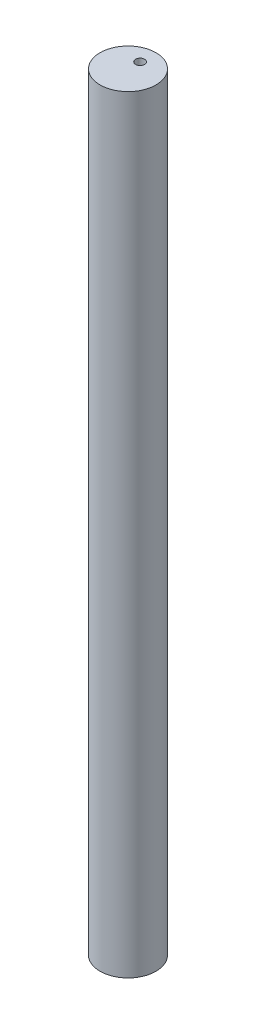
ISO-10303-21;
HEADER;
FILE_DESCRIPTION(('STEP AP214'),'2;1');
FILE_NAME('part.step','',(''),(''),'','','');
FILE_SCHEMA(('AUTOMOTIVE_DESIGN { 1 0 10303 214 1 1 1 1 }'));
ENDSEC;
DATA;
#1=APPLICATION_CONTEXT('core data for automotive mechanical design processes');
#2=APPLICATION_PROTOCOL_DEFINITION('international standard','automotive_design',2000,#1);
#3=PRODUCT_CONTEXT('',#1,'mechanical');
#4=PRODUCT('Part','Part','',(#3));
#5=PRODUCT_RELATED_PRODUCT_CATEGORY('part','',(#4));
#6=PRODUCT_DEFINITION_FORMATION('','',#4);
#7=PRODUCT_DEFINITION_CONTEXT('part definition',#1,'design');
#8=PRODUCT_DEFINITION('design','',#6,#7);
#9=PRODUCT_DEFINITION_SHAPE('','',#8);
#10=(LENGTH_UNIT() NAMED_UNIT(*) SI_UNIT(.MILLI.,.METRE.));
#11=(NAMED_UNIT(*) PLANE_ANGLE_UNIT() SI_UNIT($,.RADIAN.));
#12=(NAMED_UNIT(*) SI_UNIT($,.STERADIAN.) SOLID_ANGLE_UNIT());
#13=UNCERTAINTY_MEASURE_WITH_UNIT(LENGTH_MEASURE(1.E-05),#10,'distance_accuracy_value','');
#14=(GEOMETRIC_REPRESENTATION_CONTEXT(3) GLOBAL_UNCERTAINTY_ASSIGNED_CONTEXT((#13)) GLOBAL_UNIT_ASSIGNED_CONTEXT((#10,
#11,#12)) REPRESENTATION_CONTEXT('',''));
#15=CARTESIAN_POINT('',(0.,0.,0.));
#16=DIRECTION('',(0.,0.,1.));
#17=DIRECTION('',(1.,0.,0.));
#18=AXIS2_PLACEMENT_3D('',#15,#16,#17);
#19=CARTESIAN_POINT('',(0.,304.8,0.));
#20=DIRECTION('',(0.,-1.,0.));
#21=DIRECTION('',(0.,0.,-1.));
#22=AXIS2_PLACEMENT_3D('',#19,#20,#21);
#23=CYLINDRICAL_SURFACE('',#22,11.1);
#24=CARTESIAN_POINT('',(0.,304.8,0.));
#25=DIRECTION('',(0.,1.,0.));
#26=DIRECTION('',(0.,0.,1.));
#27=AXIS2_PLACEMENT_3D('',#24,#25,#26);
#28=CIRCLE('',#27,11.1);
#29=CARTESIAN_POINT('',(0.,304.8,-11.1));
#30=VERTEX_POINT('',#29);
#31=EDGE_CURVE('E10',#30,#30,#28,.T.);
#32=CARTESIAN_POINT('',(0.,0.,0.));
#33=DIRECTION('',(0.,1.,0.));
#34=DIRECTION('',(0.,0.,1.));
#35=AXIS2_PLACEMENT_3D('',#32,#33,#34);
#36=CIRCLE('',#35,11.1);
#37=CARTESIAN_POINT('',(0.,0.,-11.1));
#38=VERTEX_POINT('',#37);
#39=EDGE_CURVE('E34',#38,#38,#36,.T.);
#40=CARTESIAN_POINT('',(0.,304.8,-11.1));
#41=CARTESIAN_POINT('',(0.,301.625,-11.1));
#42=CARTESIAN_POINT('',(0.,298.45,-11.1));
#43=CARTESIAN_POINT('',(0.,292.1,-11.1));
#44=CARTESIAN_POINT('',(0.,288.925,-11.1));
#45=CARTESIAN_POINT('',(0.,282.575,-11.1));
#46=CARTESIAN_POINT('',(0.,279.4,-11.1));
#47=CARTESIAN_POINT('',(0.,273.05,-11.1));
#48=CARTESIAN_POINT('',(0.,269.875,-11.1));
#49=CARTESIAN_POINT('',(0.,263.525,-11.1));
#50=CARTESIAN_POINT('',(0.,260.35,-11.1));
#51=CARTESIAN_POINT('',(0.,254.,-11.1));
#52=CARTESIAN_POINT('',(0.,250.825,-11.1));
#53=CARTESIAN_POINT('',(0.,244.475,-11.1));
#54=CARTESIAN_POINT('',(0.,241.3,-11.1));
#55=CARTESIAN_POINT('',(0.,234.95,-11.1));
#56=CARTESIAN_POINT('',(0.,231.775,-11.1));
#57=CARTESIAN_POINT('',(0.,225.425,-11.1));
#58=CARTESIAN_POINT('',(0.,222.25,-11.1));
#59=CARTESIAN_POINT('',(0.,215.9,-11.1));
#60=CARTESIAN_POINT('',(0.,212.725,-11.1));
#61=CARTESIAN_POINT('',(0.,206.375,-11.1));
#62=CARTESIAN_POINT('',(0.,203.2,-11.1));
#63=CARTESIAN_POINT('',(0.,196.85,-11.1));
#64=CARTESIAN_POINT('',(0.,193.675,-11.1));
#65=CARTESIAN_POINT('',(0.,187.325,-11.1));
#66=CARTESIAN_POINT('',(0.,184.15,-11.1));
#67=CARTESIAN_POINT('',(0.,177.8,-11.1));
#68=CARTESIAN_POINT('',(0.,174.625,-11.1));
#69=CARTESIAN_POINT('',(0.,168.275,-11.1));
#70=CARTESIAN_POINT('',(0.,165.1,-11.1));
#71=CARTESIAN_POINT('',(0.,158.75,-11.1));
#72=CARTESIAN_POINT('',(0.,155.575,-11.1));
#73=CARTESIAN_POINT('',(0.,149.225,-11.1));
#74=CARTESIAN_POINT('',(0.,146.05,-11.1));
#75=CARTESIAN_POINT('',(0.,139.7,-11.1));
#76=CARTESIAN_POINT('',(0.,136.525,-11.1));
#77=CARTESIAN_POINT('',(0.,130.175,-11.1));
#78=CARTESIAN_POINT('',(0.,127.,-11.1));
#79=CARTESIAN_POINT('',(0.,120.65,-11.1));
#80=CARTESIAN_POINT('',(0.,117.475,-11.1));
#81=CARTESIAN_POINT('',(0.,111.125,-11.1));
#82=CARTESIAN_POINT('',(0.,107.95,-11.1));
#83=CARTESIAN_POINT('',(0.,101.6,-11.1));
#84=CARTESIAN_POINT('',(0.,98.425,-11.1));
#85=CARTESIAN_POINT('',(0.,92.075,-11.1));
#86=CARTESIAN_POINT('',(0.,88.9,-11.1));
#87=CARTESIAN_POINT('',(0.,82.55,-11.1));
#88=CARTESIAN_POINT('',(0.,79.375,-11.1));
#89=CARTESIAN_POINT('',(0.,73.025,-11.1));
#90=CARTESIAN_POINT('',(0.,69.85,-11.1));
#91=CARTESIAN_POINT('',(0.,63.5,-11.1));
#92=CARTESIAN_POINT('',(0.,60.325,-11.1));
#93=CARTESIAN_POINT('',(0.,53.975,-11.1));
#94=CARTESIAN_POINT('',(0.,50.8,-11.1));
#95=CARTESIAN_POINT('',(0.,44.45,-11.1));
#96=CARTESIAN_POINT('',(0.,41.275,-11.1));
#97=CARTESIAN_POINT('',(0.,34.925,-11.1));
#98=CARTESIAN_POINT('',(0.,31.75,-11.1));
#99=CARTESIAN_POINT('',(0.,25.4,-11.1));
#100=CARTESIAN_POINT('',(0.,22.225,-11.1));
#101=CARTESIAN_POINT('',(0.,15.875,-11.1));
#102=CARTESIAN_POINT('',(0.,12.7,-11.1));
#103=CARTESIAN_POINT('',(0.,6.35,-11.1));
#104=CARTESIAN_POINT('',(0.,3.175,-11.1));
#105=CARTESIAN_POINT('',(0.,0.,-11.1));
#106=B_SPLINE_CURVE_WITH_KNOTS('',3,(#40,#41,#42,#43,#44,#45,#46,#47,#48,#49,#50,#51,#52,#53,
#54,#55,#56,#57,#58,#59,#60,#61,#62,#63,#64,#65,#66,#67,#68,#69,#70,#71,#72,#73,#74,#75,#76,#77,
#78,#79,#80,#81,#82,#83,#84,#85,#86,#87,#88,#89,#90,#91,#92,#93,#94,#95,#96,#97,#98,#99,#100,
#101,#102,#103,#104,#105),.UNSPECIFIED.,.F.,.F.,(4,2,2,2,2,2,2,2,2,2,2,2,2,2,2,2,2,2,2,2,2,2,2,
2,2,2,2,2,2,2,2,2,4),(0.,9.52499999999995,19.05,28.575,38.1,47.625,57.15,66.675,76.2,85.725,
95.2499999999999,104.775,114.3,123.825,133.35,142.875,152.4,161.925,171.45,180.975,190.5,
200.025,209.55,219.075,228.6,238.125,247.65,257.175,266.7,276.225,285.75,295.275,304.8),.UNSPECIFIED.);
#107=EDGE_CURVE('BSEAM31',#30,#38,#106,.T.);
#108=ORIENTED_EDGE('',*,*,#31,.F.);
#109=ORIENTED_EDGE('',*,*,#39,.T.);
#110=ORIENTED_EDGE('',*,*,#107,.T.);
#111=ORIENTED_EDGE('',*,*,#107,.F.);
#112=EDGE_LOOP('',(#108,#110,#109,#111));
#113=FACE_BOUND('',#112,.T.);
#114=ADVANCED_FACE('F31',(#113),#23,.T.);
#115=CARTESIAN_POINT('',(0.,304.8,0.));
#116=DIRECTION('',(0.,1.,0.));
#117=DIRECTION('',(0.,0.,1.));
#118=AXIS2_PLACEMENT_3D('',#115,#116,#117);
#119=PLANE('',#118);
#120=CARTESIAN_POINT('',(0.,304.8,-4.8));
#121=DIRECTION('',(0.,1.,0.));
#122=DIRECTION('',(0.,0.,1.));
#123=AXIS2_PLACEMENT_3D('',#120,#121,#122);
#124=CIRCLE('',#123,1.8);
#125=CARTESIAN_POINT('',(0.,304.8,-3.));
#126=VERTEX_POINT('',#125);
#127=EDGE_CURVE('E43',#126,#126,#124,.T.);
#128=ORIENTED_EDGE('',*,*,#127,.F.);
#129=EDGE_LOOP('',(#128));
#130=FACE_BOUND('',#129,.T.);
#131=ORIENTED_EDGE('',*,*,#31,.T.);
#132=EDGE_LOOP('',(#131));
#133=FACE_BOUND('',#132,.T.);
#134=ADVANCED_FACE('F58',(#130,#133),#119,.T.);
#135=CARTESIAN_POINT('',(0.,0.,0.));
#136=DIRECTION('',(0.,1.,0.));
#137=DIRECTION('',(0.,0.,1.));
#138=AXIS2_PLACEMENT_3D('',#135,#136,#137);
#139=PLANE('',#138);
#140=ORIENTED_EDGE('',*,*,#39,.F.);
#141=EDGE_LOOP('',(#140));
#142=FACE_BOUND('',#141,.T.);
#143=ADVANCED_FACE('F54',(#142),#139,.F.);
#144=CARTESIAN_POINT('',(0.,292.2,-4.8));
#145=DIRECTION('',(0.,1.,0.));
#146=DIRECTION('',(0.,0.,1.));
#147=AXIS2_PLACEMENT_3D('',#144,#145,#146);
#148=CYLINDRICAL_SURFACE('',#147,1.8);
#149=CARTESIAN_POINT('',(0.,292.2,-4.8));
#150=DIRECTION('',(0.,1.,0.));
#151=DIRECTION('',(0.,0.,1.));
#152=AXIS2_PLACEMENT_3D('',#149,#150,#151);
#153=CIRCLE('',#152,1.8);
#154=CARTESIAN_POINT('',(0.,292.2,-3.));
#155=VERTEX_POINT('',#154);
#156=EDGE_CURVE('E41',#155,#155,#153,.T.);
#157=ORIENTED_EDGE('',*,*,#156,.F.);
#158=EDGE_LOOP('',(#157));
#159=FACE_BOUND('',#158,.T.);
#160=ORIENTED_EDGE('',*,*,#127,.T.);
#161=EDGE_LOOP('',(#160));
#162=FACE_BOUND('',#161,.T.);
#163=ADVANCED_FACE('F51',(#159,#162),#148,.F.);
#164=CARTESIAN_POINT('',(0.,292.2,-4.8));
#165=DIRECTION('',(0.,1.,0.));
#166=DIRECTION('',(0.,0.,1.));
#167=AXIS2_PLACEMENT_3D('',#164,#165,#166);
#168=PLANE('',#167);
#169=ORIENTED_EDGE('',*,*,#156,.T.);
#170=EDGE_LOOP('',(#169));
#171=FACE_BOUND('',#170,.T.);
#172=ADVANCED_FACE('F49',(#171),#168,.T.);
#173=CLOSED_SHELL('',(#114,#134,#143,#163,#172));
#174=MANIFOLD_SOLID_BREP('B2',#173);
#175=ADVANCED_BREP_SHAPE_REPRESENTATION('',(#18,#174),#14);
#176=SHAPE_DEFINITION_REPRESENTATION(#9,#175);
ENDSEC;
END-ISO-10303-21;
